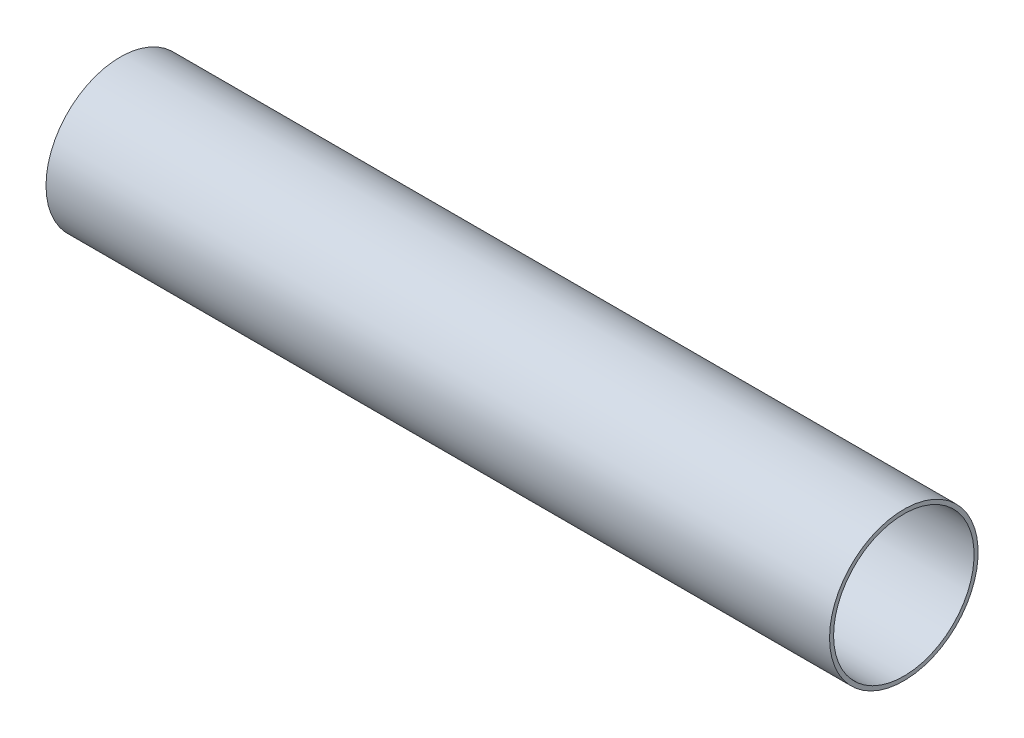
ISO-10303-21;
HEADER;
FILE_DESCRIPTION(('STEP AP214'),'2;1');
FILE_NAME('part.step','',(''),(''),'','','');
FILE_SCHEMA(('AUTOMOTIVE_DESIGN { 1 0 10303 214 1 1 1 1 }'));
ENDSEC;
DATA;
#1=APPLICATION_CONTEXT('core data for automotive mechanical design processes');
#2=APPLICATION_PROTOCOL_DEFINITION('international standard','automotive_design',2000,#1);
#3=PRODUCT_CONTEXT('',#1,'mechanical');
#4=PRODUCT('Part','Part','',(#3));
#5=PRODUCT_RELATED_PRODUCT_CATEGORY('part','',(#4));
#6=PRODUCT_DEFINITION_FORMATION('','',#4);
#7=PRODUCT_DEFINITION_CONTEXT('part definition',#1,'design');
#8=PRODUCT_DEFINITION('design','',#6,#7);
#9=PRODUCT_DEFINITION_SHAPE('','',#8);
#10=(LENGTH_UNIT() NAMED_UNIT(*) SI_UNIT(.MILLI.,.METRE.));
#11=(NAMED_UNIT(*) PLANE_ANGLE_UNIT() SI_UNIT($,.RADIAN.));
#12=(NAMED_UNIT(*) SI_UNIT($,.STERADIAN.) SOLID_ANGLE_UNIT());
#13=UNCERTAINTY_MEASURE_WITH_UNIT(LENGTH_MEASURE(1.E-05),#10,'distance_accuracy_value','');
#14=(GEOMETRIC_REPRESENTATION_CONTEXT(3) GLOBAL_UNCERTAINTY_ASSIGNED_CONTEXT((#13)) GLOBAL_UNIT_ASSIGNED_CONTEXT((#10,
#11,#12)) REPRESENTATION_CONTEXT('',''));
#15=CARTESIAN_POINT('',(0.,0.,0.));
#16=DIRECTION('',(0.,0.,1.));
#17=DIRECTION('',(1.,0.,0.));
#18=AXIS2_PLACEMENT_3D('',#15,#16,#17);
#19=CARTESIAN_POINT('',(304.8,0.,0.));
#20=DIRECTION('',(1.,0.,0.));
#21=DIRECTION('',(0.,0.,-1.));
#22=AXIS2_PLACEMENT_3D('',#19,#20,#21);
#23=PLANE('',#22);
#24=CARTESIAN_POINT('',(304.8,0.,0.));
#25=DIRECTION('',(1.,0.,0.));
#26=DIRECTION('',(0.,0.,-1.));
#27=AXIS2_PLACEMENT_3D('',#24,#25,#26);
#28=CIRCLE('',#27,28.9052);
#29=CARTESIAN_POINT('',(304.8,0.,28.9052));
#30=VERTEX_POINT('',#29);
#31=EDGE_CURVE('E11',#30,#30,#28,.T.);
#32=ORIENTED_EDGE('',*,*,#31,.T.);
#33=EDGE_LOOP('',(#32));
#34=FACE_BOUND('',#33,.T.);
#35=CARTESIAN_POINT('',(304.8,0.,0.));
#36=DIRECTION('',(1.,0.,0.));
#37=DIRECTION('',(0.,0.,-1.));
#38=AXIS2_PLACEMENT_3D('',#35,#36,#37);
#39=CIRCLE('',#38,27.3304);
#40=CARTESIAN_POINT('',(304.8,0.,27.3304));
#41=VERTEX_POINT('',#40);
#42=EDGE_CURVE('E64',#41,#41,#39,.T.);
#43=ORIENTED_EDGE('',*,*,#42,.F.);
#44=EDGE_LOOP('',(#43));
#45=FACE_BOUND('',#44,.T.);
#46=ADVANCED_FACE('F51',(#34,#45),#23,.T.);
#47=CARTESIAN_POINT('',(0.,0.,0.));
#48=DIRECTION('',(1.,0.,0.));
#49=DIRECTION('',(0.,0.,-1.));
#50=AXIS2_PLACEMENT_3D('',#47,#48,#49);
#51=PLANE('',#50);
#52=CARTESIAN_POINT('',(0.,0.,0.));
#53=DIRECTION('',(1.,0.,0.));
#54=DIRECTION('',(0.,0.,-1.));
#55=AXIS2_PLACEMENT_3D('',#52,#53,#54);
#56=CIRCLE('',#55,28.9052);
#57=CARTESIAN_POINT('',(0.,0.,28.9052));
#58=VERTEX_POINT('',#57);
#59=EDGE_CURVE('E55',#58,#58,#56,.T.);
#60=ORIENTED_EDGE('',*,*,#59,.F.);
#61=EDGE_LOOP('',(#60));
#62=FACE_BOUND('',#61,.T.);
#63=CARTESIAN_POINT('',(0.,0.,0.));
#64=DIRECTION('',(1.,0.,0.));
#65=DIRECTION('',(0.,0.,-1.));
#66=AXIS2_PLACEMENT_3D('',#63,#64,#65);
#67=CIRCLE('',#66,27.3304);
#68=CARTESIAN_POINT('',(0.,0.,27.3304));
#69=VERTEX_POINT('',#68);
#70=EDGE_CURVE('E66',#69,#69,#67,.T.);
#71=ORIENTED_EDGE('',*,*,#70,.T.);
#72=EDGE_LOOP('',(#71));
#73=FACE_BOUND('',#72,.T.);
#74=ADVANCED_FACE('F78',(#62,#73),#51,.F.);
#75=CARTESIAN_POINT('',(304.8,0.,0.));
#76=DIRECTION('',(-1.,0.,0.));
#77=DIRECTION('',(0.,0.,1.));
#78=AXIS2_PLACEMENT_3D('',#75,#76,#77);
#79=CYLINDRICAL_SURFACE('',#78,28.9052);
#80=CARTESIAN_POINT('',(304.8,0.,28.9052));
#81=CARTESIAN_POINT('',(301.625,0.,28.9052));
#82=CARTESIAN_POINT('',(298.45,0.,28.9052));
#83=CARTESIAN_POINT('',(292.1,0.,28.9052));
#84=CARTESIAN_POINT('',(288.925,0.,28.9052));
#85=CARTESIAN_POINT('',(282.575,0.,28.9052));
#86=CARTESIAN_POINT('',(279.4,0.,28.9052));
#87=CARTESIAN_POINT('',(273.05,0.,28.9052));
#88=CARTESIAN_POINT('',(269.875,0.,28.9052));
#89=CARTESIAN_POINT('',(263.525,0.,28.9052));
#90=CARTESIAN_POINT('',(260.35,0.,28.9052));
#91=CARTESIAN_POINT('',(254.,0.,28.9052));
#92=CARTESIAN_POINT('',(250.825,0.,28.9052));
#93=CARTESIAN_POINT('',(244.475,0.,28.9052));
#94=CARTESIAN_POINT('',(241.3,0.,28.9052));
#95=CARTESIAN_POINT('',(234.95,0.,28.9052));
#96=CARTESIAN_POINT('',(231.775,0.,28.9052));
#97=CARTESIAN_POINT('',(225.425,0.,28.9052));
#98=CARTESIAN_POINT('',(222.25,0.,28.9052));
#99=CARTESIAN_POINT('',(215.9,0.,28.9052));
#100=CARTESIAN_POINT('',(212.725,0.,28.9052));
#101=CARTESIAN_POINT('',(206.375,0.,28.9052));
#102=CARTESIAN_POINT('',(203.2,0.,28.9052));
#103=CARTESIAN_POINT('',(196.85,0.,28.9052));
#104=CARTESIAN_POINT('',(193.675,0.,28.9052));
#105=CARTESIAN_POINT('',(187.325,0.,28.9052));
#106=CARTESIAN_POINT('',(184.15,0.,28.9052));
#107=CARTESIAN_POINT('',(177.8,0.,28.9052));
#108=CARTESIAN_POINT('',(174.625,0.,28.9052));
#109=CARTESIAN_POINT('',(168.275,0.,28.9052));
#110=CARTESIAN_POINT('',(165.1,0.,28.9052));
#111=CARTESIAN_POINT('',(158.75,0.,28.9052));
#112=CARTESIAN_POINT('',(155.575,0.,28.9052));
#113=CARTESIAN_POINT('',(149.225,0.,28.9052));
#114=CARTESIAN_POINT('',(146.05,0.,28.9052));
#115=CARTESIAN_POINT('',(139.7,0.,28.9052));
#116=CARTESIAN_POINT('',(136.525,0.,28.9052));
#117=CARTESIAN_POINT('',(130.175,0.,28.9052));
#118=CARTESIAN_POINT('',(127.,0.,28.9052));
#119=CARTESIAN_POINT('',(120.65,0.,28.9052));
#120=CARTESIAN_POINT('',(117.475,0.,28.9052));
#121=CARTESIAN_POINT('',(111.125,0.,28.9052));
#122=CARTESIAN_POINT('',(107.95,0.,28.9052));
#123=CARTESIAN_POINT('',(101.6,0.,28.9052));
#124=CARTESIAN_POINT('',(98.425,0.,28.9052));
#125=CARTESIAN_POINT('',(92.075,0.,28.9052));
#126=CARTESIAN_POINT('',(88.9,0.,28.9052));
#127=CARTESIAN_POINT('',(82.55,0.,28.9052));
#128=CARTESIAN_POINT('',(79.375,0.,28.9052));
#129=CARTESIAN_POINT('',(73.025,0.,28.9052));
#130=CARTESIAN_POINT('',(69.85,0.,28.9052));
#131=CARTESIAN_POINT('',(63.5,0.,28.9052));
#132=CARTESIAN_POINT('',(60.325,0.,28.9052));
#133=CARTESIAN_POINT('',(53.975,0.,28.9052));
#134=CARTESIAN_POINT('',(50.8,0.,28.9052));
#135=CARTESIAN_POINT('',(44.45,0.,28.9052));
#136=CARTESIAN_POINT('',(41.275,0.,28.9052));
#137=CARTESIAN_POINT('',(34.925,0.,28.9052));
#138=CARTESIAN_POINT('',(31.75,0.,28.9052));
#139=CARTESIAN_POINT('',(25.4,0.,28.9052));
#140=CARTESIAN_POINT('',(22.225,0.,28.9052));
#141=CARTESIAN_POINT('',(15.875,0.,28.9052));
#142=CARTESIAN_POINT('',(12.7,0.,28.9052));
#143=CARTESIAN_POINT('',(6.35,0.,28.9052));
#144=CARTESIAN_POINT('',(3.175,0.,28.9052));
#145=CARTESIAN_POINT('',(0.,0.,28.9052));
#146=B_SPLINE_CURVE_WITH_KNOTS('',3,(#80,#81,#82,#83,#84,#85,#86,#87,#88,#89,#90,#91,#92,#93,
#94,#95,#96,#97,#98,#99,#100,#101,#102,#103,#104,#105,#106,#107,#108,#109,#110,#111,#112,#113,
#114,#115,#116,#117,#118,#119,#120,#121,#122,#123,#124,#125,#126,#127,#128,#129,#130,#131,#132,
#133,#134,#135,#136,#137,#138,#139,#140,#141,#142,#143,#144,#145),.UNSPECIFIED.,.F.,.F.,(4,2,2,
2,2,2,2,2,2,2,2,2,2,2,2,2,2,2,2,2,2,2,2,2,2,2,2,2,2,2,2,2,4),(0.,9.52499999999995,19.05,28.575,
38.1,47.625,57.15,66.675,76.2,85.725,95.2499999999999,104.775,114.3,123.825,133.35,142.875,
152.4,161.925,171.45,180.975,190.5,200.025,209.55,219.075,228.6,238.125,247.65,257.175,266.7,
276.225,285.75,295.275,304.8),.UNSPECIFIED.);
#147=EDGE_CURVE('BSEAM53',#30,#58,#146,.T.);
#148=ORIENTED_EDGE('',*,*,#31,.F.);
#149=ORIENTED_EDGE('',*,*,#59,.T.);
#150=ORIENTED_EDGE('',*,*,#147,.T.);
#151=ORIENTED_EDGE('',*,*,#147,.F.);
#152=EDGE_LOOP('',(#148,#150,#149,#151));
#153=FACE_BOUND('',#152,.T.);
#154=ADVANCED_FACE('F53',(#153),#79,.T.);
#155=CARTESIAN_POINT('',(304.8,0.,0.));
#156=DIRECTION('',(-1.,0.,0.));
#157=DIRECTION('',(0.,0.,1.));
#158=AXIS2_PLACEMENT_3D('',#155,#156,#157);
#159=CYLINDRICAL_SURFACE('',#158,27.3304);
#160=CARTESIAN_POINT('',(304.8,0.,27.3304));
#161=CARTESIAN_POINT('',(301.625,0.,27.3304));
#162=CARTESIAN_POINT('',(298.45,0.,27.3304));
#163=CARTESIAN_POINT('',(292.1,0.,27.3304));
#164=CARTESIAN_POINT('',(288.925,0.,27.3304));
#165=CARTESIAN_POINT('',(282.575,0.,27.3304));
#166=CARTESIAN_POINT('',(279.4,0.,27.3304));
#167=CARTESIAN_POINT('',(273.05,0.,27.3304));
#168=CARTESIAN_POINT('',(269.875,0.,27.3304));
#169=CARTESIAN_POINT('',(263.525,0.,27.3304));
#170=CARTESIAN_POINT('',(260.35,0.,27.3304));
#171=CARTESIAN_POINT('',(254.,0.,27.3304));
#172=CARTESIAN_POINT('',(250.825,0.,27.3304));
#173=CARTESIAN_POINT('',(244.475,0.,27.3304));
#174=CARTESIAN_POINT('',(241.3,0.,27.3304));
#175=CARTESIAN_POINT('',(234.95,0.,27.3304));
#176=CARTESIAN_POINT('',(231.775,0.,27.3304));
#177=CARTESIAN_POINT('',(225.425,0.,27.3304));
#178=CARTESIAN_POINT('',(222.25,0.,27.3304));
#179=CARTESIAN_POINT('',(215.9,0.,27.3304));
#180=CARTESIAN_POINT('',(212.725,0.,27.3304));
#181=CARTESIAN_POINT('',(206.375,0.,27.3304));
#182=CARTESIAN_POINT('',(203.2,0.,27.3304));
#183=CARTESIAN_POINT('',(196.85,0.,27.3304));
#184=CARTESIAN_POINT('',(193.675,0.,27.3304));
#185=CARTESIAN_POINT('',(187.325,0.,27.3304));
#186=CARTESIAN_POINT('',(184.15,0.,27.3304));
#187=CARTESIAN_POINT('',(177.8,0.,27.3304));
#188=CARTESIAN_POINT('',(174.625,0.,27.3304));
#189=CARTESIAN_POINT('',(168.275,0.,27.3304));
#190=CARTESIAN_POINT('',(165.1,0.,27.3304));
#191=CARTESIAN_POINT('',(158.75,0.,27.3304));
#192=CARTESIAN_POINT('',(155.575,0.,27.3304));
#193=CARTESIAN_POINT('',(149.225,0.,27.3304));
#194=CARTESIAN_POINT('',(146.05,0.,27.3304));
#195=CARTESIAN_POINT('',(139.7,0.,27.3304));
#196=CARTESIAN_POINT('',(136.525,0.,27.3304));
#197=CARTESIAN_POINT('',(130.175,0.,27.3304));
#198=CARTESIAN_POINT('',(127.,0.,27.3304));
#199=CARTESIAN_POINT('',(120.65,0.,27.3304));
#200=CARTESIAN_POINT('',(117.475,0.,27.3304));
#201=CARTESIAN_POINT('',(111.125,0.,27.3304));
#202=CARTESIAN_POINT('',(107.95,0.,27.3304));
#203=CARTESIAN_POINT('',(101.6,0.,27.3304));
#204=CARTESIAN_POINT('',(98.425,0.,27.3304));
#205=CARTESIAN_POINT('',(92.075,0.,27.3304));
#206=CARTESIAN_POINT('',(88.9,0.,27.3304));
#207=CARTESIAN_POINT('',(82.55,0.,27.3304));
#208=CARTESIAN_POINT('',(79.375,0.,27.3304));
#209=CARTESIAN_POINT('',(73.025,0.,27.3304));
#210=CARTESIAN_POINT('',(69.85,0.,27.3304));
#211=CARTESIAN_POINT('',(63.5,0.,27.3304));
#212=CARTESIAN_POINT('',(60.325,0.,27.3304));
#213=CARTESIAN_POINT('',(53.975,0.,27.3304));
#214=CARTESIAN_POINT('',(50.8,0.,27.3304));
#215=CARTESIAN_POINT('',(44.45,0.,27.3304));
#216=CARTESIAN_POINT('',(41.275,0.,27.3304));
#217=CARTESIAN_POINT('',(34.925,0.,27.3304));
#218=CARTESIAN_POINT('',(31.75,0.,27.3304));
#219=CARTESIAN_POINT('',(25.4,0.,27.3304));
#220=CARTESIAN_POINT('',(22.225,0.,27.3304));
#221=CARTESIAN_POINT('',(15.875,0.,27.3304));
#222=CARTESIAN_POINT('',(12.7,0.,27.3304));
#223=CARTESIAN_POINT('',(6.35,0.,27.3304));
#224=CARTESIAN_POINT('',(3.175,0.,27.3304));
#225=CARTESIAN_POINT('',(0.,0.,27.3304));
#226=B_SPLINE_CURVE_WITH_KNOTS('',3,(#160,#161,#162,#163,#164,#165,#166,#167,#168,#169,#170,
#171,#172,#173,#174,#175,#176,#177,#178,#179,#180,#181,#182,#183,#184,#185,#186,#187,#188,#189,
#190,#191,#192,#193,#194,#195,#196,#197,#198,#199,#200,#201,#202,#203,#204,#205,#206,#207,#208,
#209,#210,#211,#212,#213,#214,#215,#216,#217,#218,#219,#220,#221,#222,#223,#224,#225),
.UNSPECIFIED.,.F.,.F.,(4,2,2,2,2,2,2,2,2,2,2,2,2,2,2,2,2,2,2,2,2,2,2,2,2,2,2,2,2,2,2,2,4),(0.,
9.52499999999995,19.05,28.575,38.1,47.625,57.15,66.675,76.2,85.725,95.2499999999999,104.775,
114.3,123.825,133.35,142.875,152.4,161.925,171.45,180.975,190.5,200.025,209.55,219.075,228.6,
238.125,247.65,257.175,266.7,276.225,285.75,295.275,304.8),.UNSPECIFIED.);
#227=EDGE_CURVE('BSEAM74',#41,#69,#226,.T.);
#228=ORIENTED_EDGE('',*,*,#42,.T.);
#229=ORIENTED_EDGE('',*,*,#70,.F.);
#230=ORIENTED_EDGE('',*,*,#227,.T.);
#231=ORIENTED_EDGE('',*,*,#227,.F.);
#232=EDGE_LOOP('',(#228,#230,#229,#231));
#233=FACE_BOUND('',#232,.T.);
#234=ADVANCED_FACE('F74',(#233),#159,.F.);
#235=CLOSED_SHELL('',(#46,#74,#154,#234));
#236=MANIFOLD_SOLID_BREP('B2',#235);
#237=ADVANCED_BREP_SHAPE_REPRESENTATION('',(#18,#236),#14);
#238=SHAPE_DEFINITION_REPRESENTATION(#9,#237);
ENDSEC;
END-ISO-10303-21;
